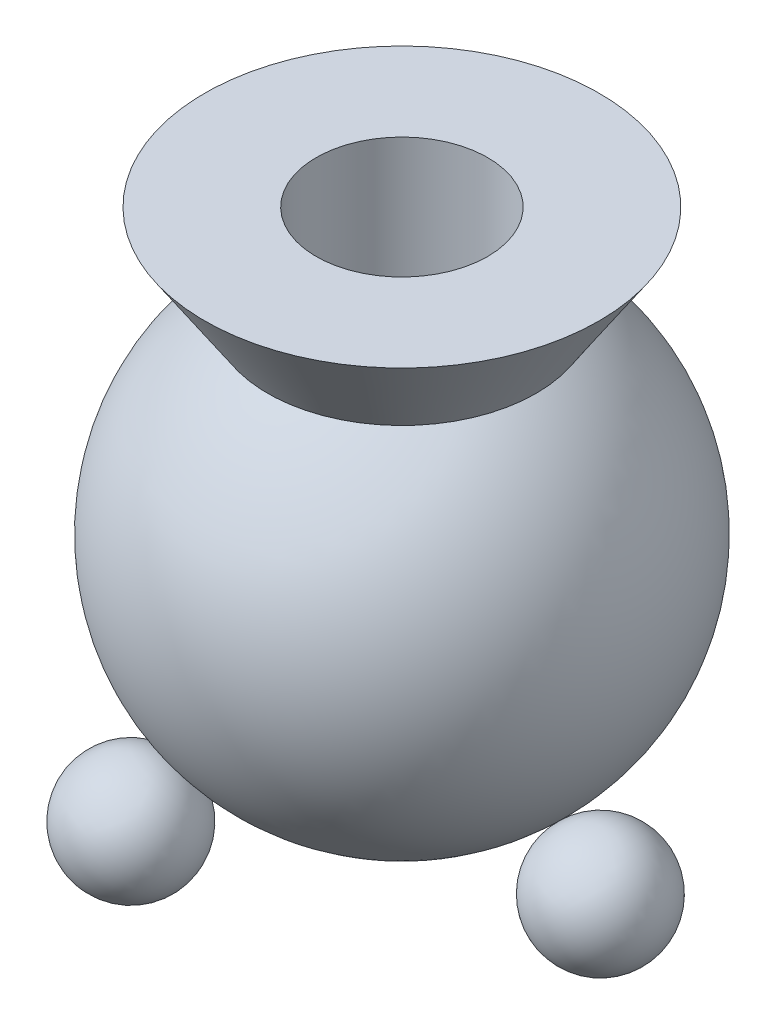
ISO-10303-21;
HEADER;
FILE_DESCRIPTION(('STEP AP214'),'2;1');
FILE_NAME('part.step','',(''),(''),'','','');
FILE_SCHEMA(('AUTOMOTIVE_DESIGN { 1 0 10303 214 1 1 1 1 }'));
ENDSEC;
DATA;
#1=APPLICATION_CONTEXT('core data for automotive mechanical design processes');
#2=APPLICATION_PROTOCOL_DEFINITION('international standard','automotive_design',2000,#1);
#3=PRODUCT_CONTEXT('',#1,'mechanical');
#4=PRODUCT('Part','Part','',(#3));
#5=PRODUCT_RELATED_PRODUCT_CATEGORY('part','',(#4));
#6=PRODUCT_DEFINITION_FORMATION('','',#4);
#7=PRODUCT_DEFINITION_CONTEXT('part definition',#1,'design');
#8=PRODUCT_DEFINITION('design','',#6,#7);
#9=PRODUCT_DEFINITION_SHAPE('','',#8);
#10=(LENGTH_UNIT() NAMED_UNIT(*) SI_UNIT(.MILLI.,.METRE.));
#11=(NAMED_UNIT(*) PLANE_ANGLE_UNIT() SI_UNIT($,.RADIAN.));
#12=(NAMED_UNIT(*) SI_UNIT($,.STERADIAN.) SOLID_ANGLE_UNIT());
#13=UNCERTAINTY_MEASURE_WITH_UNIT(LENGTH_MEASURE(1.E-05),#10,'distance_accuracy_value','');
#14=(GEOMETRIC_REPRESENTATION_CONTEXT(3) GLOBAL_UNCERTAINTY_ASSIGNED_CONTEXT((#13)) GLOBAL_UNIT_ASSIGNED_CONTEXT((#10,
#11,#12)) REPRESENTATION_CONTEXT('',''));
#15=CARTESIAN_POINT('',(0.,0.,0.));
#16=DIRECTION('',(0.,0.,1.));
#17=DIRECTION('',(1.,0.,0.));
#18=AXIS2_PLACEMENT_3D('',#15,#16,#17);
#19=CARTESIAN_POINT('',(-11.5717496911723,2.18647306371758,-20.0428583975803));
#20=DIRECTION('',(0.341034734517063,0.731287384966739,0.590689487329328));
#21=DIRECTION('',(0.365643692483364,-0.682069469034136,0.63331345284829));
#22=AXIS2_PLACEMENT_3D('',#19,#20,#21);
#23=SPHERICAL_SURFACE('',#22,6.93129356034358);
#24=CARTESIAN_POINT('',(-9.20793783196069,7.25524060589804,-15.9486161578919));
#25=VERTEX_POINT('',#24);
#26=VERTEX_LOOP('',#25);
#27=FACE_BOUND('',#26,.T.);
#28=ADVANCED_FACE('F38',(#27),#23,.T.);
#29=CLOSED_SHELL('',(#28));
#30=MANIFOLD_SOLID_BREP('B2',#29);
#31=CARTESIAN_POINT('',(-11.5717496911726,2.18647306371758,20.0428583975801));
#32=DIRECTION('',(0.341034734517071,0.731287384966739,-0.590689487329324));
#33=DIRECTION('',(0.365643692483373,-0.682069469034136,-0.633313452848285));
#34=AXIS2_PLACEMENT_3D('',#31,#32,#33);
#35=SPHERICAL_SURFACE('',#34,6.93129356034358);
#36=CARTESIAN_POINT('',(-9.20793783196091,7.25524060589804,15.9486161578917));
#37=VERTEX_POINT('',#36);
#38=VERTEX_LOOP('',#37);
#39=FACE_BOUND('',#38,.T.);
#40=ADVANCED_FACE('F57',(#39),#35,.T.);
#41=CLOSED_SHELL('',(#40));
#42=MANIFOLD_SOLID_BREP('B6',#41);
#43=CARTESIAN_POINT('',(23.1434993823449,2.18647306371758,0.));
#44=DIRECTION('',(-0.682069469034136,0.731287384966739,0.));
#45=DIRECTION('',(-0.731287384966739,-0.682069469034136,0.));
#46=AXIS2_PLACEMENT_3D('',#43,#44,#45);
#47=SPHERICAL_SURFACE('',#46,6.93129356034358);
#48=CARTESIAN_POINT('',(18.4158756639217,7.25524060589804,0.));
#49=VERTEX_POINT('',#48);
#50=VERTEX_LOOP('',#49);
#51=FACE_BOUND('',#50,.T.);
#52=ADVANCED_FACE('F79',(#51),#47,.T.);
#53=CLOSED_SHELL('',(#52));
#54=MANIFOLD_SOLID_BREP('B34',#53);
#55=CARTESIAN_POINT('',(0.,27.,0.));
#56=DIRECTION('',(0.,-1.,0.));
#57=DIRECTION('',(1.,0.,0.));
#58=AXIS2_PLACEMENT_3D('',#55,#56,#57);
#59=SPHERICAL_SURFACE('',#58,27.);
#60=CARTESIAN_POINT('',(18.4158756639217,7.25524060589804,0.));
#61=VERTEX_POINT('',#60);
#62=VERTEX_LOOP('',#61);
#63=FACE_BOUND('',#62,.T.);
#64=CARTESIAN_POINT('',(0.,49.,0.));
#65=DIRECTION('',(0.,-1.,0.));
#66=DIRECTION('',(1.,0.,0.));
#67=AXIS2_PLACEMENT_3D('',#64,#65,#66);
#68=CIRCLE('',#67,15.6524758424985);
#69=CARTESIAN_POINT('',(15.6524758424985,49.,0.));
#70=VERTEX_POINT('',#69);
#71=EDGE_CURVE('E77',#70,#70,#68,.T.);
#72=ORIENTED_EDGE('',*,*,#71,.T.);
#73=EDGE_LOOP('',(#72));
#74=FACE_BOUND('',#73,.T.);
#75=ADVANCED_FACE('F94',(#63,#74),#59,.T.);
#76=CARTESIAN_POINT('',(0.,49.,0.));
#77=DIRECTION('',(0.,1.,0.));
#78=DIRECTION('',(-1.,0.,0.));
#79=AXIS2_PLACEMENT_3D('',#76,#77,#78);
#80=CONICAL_SURFACE('',#79,15.6524758424985,0.588895200634733);
#81=CARTESIAN_POINT('',(0.,60.,0.));
#82=DIRECTION('',(0.,-1.,0.));
#83=DIRECTION('',(1.,0.,0.));
#84=AXIS2_PLACEMENT_3D('',#81,#82,#83);
#85=CIRCLE('',#84,23.);
#86=CARTESIAN_POINT('',(23.,60.,0.));
#87=VERTEX_POINT('',#86);
#88=EDGE_CURVE('E100',#87,#87,#85,.T.);
#89=ORIENTED_EDGE('',*,*,#88,.T.);
#90=EDGE_LOOP('',(#89));
#91=FACE_BOUND('',#90,.T.);
#92=ORIENTED_EDGE('',*,*,#71,.F.);
#93=EDGE_LOOP('',(#92));
#94=FACE_BOUND('',#93,.T.);
#95=ADVANCED_FACE('F105',(#91,#94),#80,.T.);
#96=CARTESIAN_POINT('',(10.,60.,0.));
#97=DIRECTION('',(0.,1.,0.));
#98=DIRECTION('',(-1.,0.,0.));
#99=AXIS2_PLACEMENT_3D('',#96,#97,#98);
#100=PLANE('',#99);
#101=CARTESIAN_POINT('',(0.,60.,0.));
#102=DIRECTION('',(0.,-1.,0.));
#103=DIRECTION('',(1.,0.,0.));
#104=AXIS2_PLACEMENT_3D('',#101,#102,#103);
#105=CIRCLE('',#104,10.);
#106=CARTESIAN_POINT('',(10.,60.,0.));
#107=VERTEX_POINT('',#106);
#108=EDGE_CURVE('E130',#107,#107,#105,.T.);
#109=ORIENTED_EDGE('',*,*,#108,.T.);
#110=EDGE_LOOP('',(#109));
#111=FACE_BOUND('',#110,.T.);
#112=ORIENTED_EDGE('',*,*,#88,.F.);
#113=EDGE_LOOP('',(#112));
#114=FACE_BOUND('',#113,.T.);
#115=ADVANCED_FACE('F109',(#111,#114),#100,.T.);
#116=CARTESIAN_POINT('',(0.,0.,0.));
#117=DIRECTION('',(0.,-1.,0.));
#118=DIRECTION('',(1.,0.,0.));
#119=AXIS2_PLACEMENT_3D('',#116,#117,#118);
#120=CYLINDRICAL_SURFACE('',#119,10.);
#121=CARTESIAN_POINT('',(0.,40.,0.));
#122=DIRECTION('',(0.,-1.,0.));
#123=DIRECTION('',(1.,0.,0.));
#124=AXIS2_PLACEMENT_3D('',#121,#122,#123);
#125=CIRCLE('',#124,10.);
#126=CARTESIAN_POINT('',(10.,40.,0.));
#127=VERTEX_POINT('',#126);
#128=EDGE_CURVE('E129',#127,#127,#125,.T.);
#129=ORIENTED_EDGE('',*,*,#128,.T.);
#130=EDGE_LOOP('',(#129));
#131=FACE_BOUND('',#130,.T.);
#132=ORIENTED_EDGE('',*,*,#108,.F.);
#133=EDGE_LOOP('',(#132));
#134=FACE_BOUND('',#133,.T.);
#135=ADVANCED_FACE('F114',(#131,#134),#120,.F.);
#136=CARTESIAN_POINT('',(0.,40.,0.));
#137=DIRECTION('',(0.,1.,0.));
#138=DIRECTION('',(-1.,0.,0.));
#139=AXIS2_PLACEMENT_3D('',#136,#137,#138);
#140=PLANE('',#139);
#141=ORIENTED_EDGE('',*,*,#128,.F.);
#142=EDGE_LOOP('',(#141));
#143=FACE_BOUND('',#142,.T.);
#144=ADVANCED_FACE('F121',(#143),#140,.T.);
#145=CLOSED_SHELL('',(#75,#95,#115,#135,#144));
#146=MANIFOLD_SOLID_BREP('B53',#145);
#147=ADVANCED_BREP_SHAPE_REPRESENTATION('',(#18,#30,#42,#54,#146),#14);
#148=SHAPE_DEFINITION_REPRESENTATION(#9,#147);
ENDSEC;
END-ISO-10303-21;
